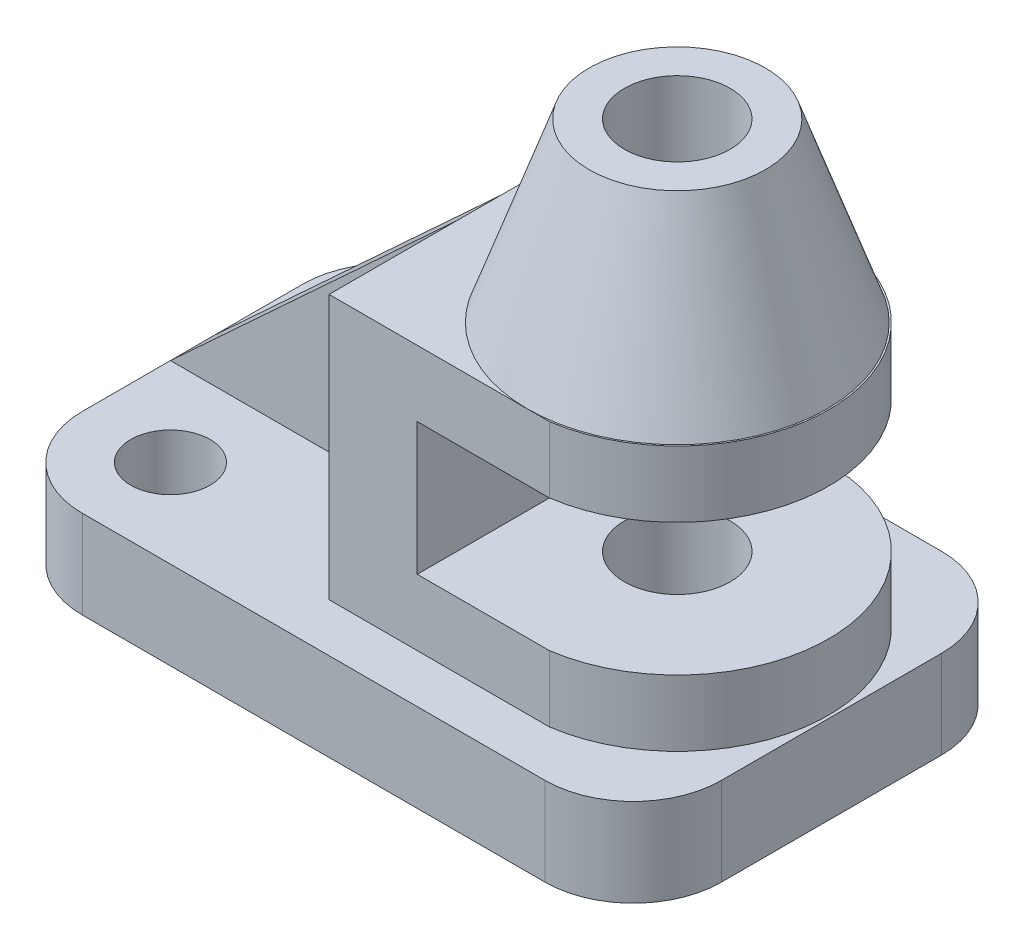
ISO-10303-21;
HEADER;
FILE_DESCRIPTION(('STEP AP214'),'2;1');
FILE_NAME('part.step','',(''),(''),'','','');
FILE_SCHEMA(('AUTOMOTIVE_DESIGN { 1 0 10303 214 1 1 1 1 }'));
ENDSEC;
DATA;
#1=APPLICATION_CONTEXT('core data for automotive mechanical design processes');
#2=APPLICATION_PROTOCOL_DEFINITION('international standard','automotive_design',2000,#1);
#3=PRODUCT_CONTEXT('',#1,'mechanical');
#4=PRODUCT('Part','Part','',(#3));
#5=PRODUCT_RELATED_PRODUCT_CATEGORY('part','',(#4));
#6=PRODUCT_DEFINITION_FORMATION('','',#4);
#7=PRODUCT_DEFINITION_CONTEXT('part definition',#1,'design');
#8=PRODUCT_DEFINITION('design','',#6,#7);
#9=PRODUCT_DEFINITION_SHAPE('','',#8);
#10=(LENGTH_UNIT() NAMED_UNIT(*) SI_UNIT(.MILLI.,.METRE.));
#11=(NAMED_UNIT(*) PLANE_ANGLE_UNIT() SI_UNIT($,.RADIAN.));
#12=(NAMED_UNIT(*) SI_UNIT($,.STERADIAN.) SOLID_ANGLE_UNIT());
#13=UNCERTAINTY_MEASURE_WITH_UNIT(LENGTH_MEASURE(1.E-05),#10,'distance_accuracy_value','');
#14=(GEOMETRIC_REPRESENTATION_CONTEXT(3) GLOBAL_UNCERTAINTY_ASSIGNED_CONTEXT((#13)) GLOBAL_UNIT_ASSIGNED_CONTEXT((#10,
#11,#12)) REPRESENTATION_CONTEXT('',''));
#15=CARTESIAN_POINT('',(0.,0.,0.));
#16=DIRECTION('',(0.,0.,1.));
#17=DIRECTION('',(1.,0.,0.));
#18=AXIS2_PLACEMENT_3D('',#15,#16,#17);
#19=CARTESIAN_POINT('',(52.5,20.,25.));
#20=DIRECTION('',(0.,-1.,0.));
#21=DIRECTION('',(0.,0.,-1.));
#22=AXIS2_PLACEMENT_3D('',#19,#20,#21);
#23=PLANE('',#22);
#24=CARTESIAN_POINT('',(-52.5,20.,-25.));
#25=DIRECTION('',(0.,1.,0.));
#26=DIRECTION('',(0.,0.,1.));
#27=AXIS2_PLACEMENT_3D('',#24,#25,#26);
#28=CIRCLE('',#27,9.);
#29=CARTESIAN_POINT('',(-52.5,20.,-16.));
#30=VERTEX_POINT('',#29);
#31=EDGE_CURVE('E224',#30,#30,#28,.T.);
#32=ORIENTED_EDGE('',*,*,#31,.F.);
#33=EDGE_LOOP('',(#32));
#34=FACE_BOUND('',#33,.T.);
#35=CARTESIAN_POINT('',(-52.5,20.,25.));
#36=DIRECTION('',(0.,1.,0.));
#37=DIRECTION('',(0.,0.,1.));
#38=AXIS2_PLACEMENT_3D('',#35,#36,#37);
#39=CIRCLE('',#38,9.);
#40=CARTESIAN_POINT('',(-52.5,20.,34.));
#41=VERTEX_POINT('',#40);
#42=EDGE_CURVE('E363',#41,#41,#39,.T.);
#43=ORIENTED_EDGE('',*,*,#42,.F.);
#44=EDGE_LOOP('',(#43));
#45=FACE_BOUND('',#44,.T.);
#46=DIRECTION('',(1.,0.,0.));
#47=VECTOR('',#46,1.);
#48=CARTESIAN_POINT('',(-7.49999999999998,20.,5.));
#49=LINE('',#48,#47);
#50=CARTESIAN_POINT('',(-72.5,20.,5.));
#51=VERTEX_POINT('',#50);
#52=CARTESIAN_POINT('',(-7.49999999999998,20.,5.));
#53=VERTEX_POINT('',#52);
#54=EDGE_CURVE('E180',#51,#53,#49,.T.);
#55=ORIENTED_EDGE('',*,*,#54,.F.);
#56=DIRECTION('',(0.,0.,1.));
#57=VECTOR('',#56,1.);
#58=CARTESIAN_POINT('',(-72.5,20.,-24.9999999999999));
#59=LINE('',#58,#57);
#60=CARTESIAN_POINT('',(-72.5,20.,24.9999999999999));
#61=VERTEX_POINT('',#60);
#62=EDGE_CURVE('E199',#51,#61,#59,.T.);
#63=ORIENTED_EDGE('',*,*,#62,.T.);
#64=CARTESIAN_POINT('',(-52.5,20.,25.));
#65=DIRECTION('',(0.,1.,0.));
#66=DIRECTION('',(0.,0.,-1.));
#67=AXIS2_PLACEMENT_3D('',#64,#65,#66);
#68=CIRCLE('',#67,20.);
#69=CARTESIAN_POINT('',(-52.4999999999999,20.,45.));
#70=VERTEX_POINT('',#69);
#71=EDGE_CURVE('E211',#61,#70,#68,.T.);
#72=ORIENTED_EDGE('',*,*,#71,.T.);
#73=DIRECTION('',(1.,0.,0.));
#74=VECTOR('',#73,1.);
#75=CARTESIAN_POINT('',(52.4999999999999,20.,45.));
#76=LINE('',#75,#74);
#77=CARTESIAN_POINT('',(52.4999999999999,20.,45.));
#78=VERTEX_POINT('',#77);
#79=EDGE_CURVE('E217',#70,#78,#76,.T.);
#80=ORIENTED_EDGE('',*,*,#79,.T.);
#81=CARTESIAN_POINT('',(52.5,20.,25.));
#82=DIRECTION('',(0.,1.,0.));
#83=DIRECTION('',(0.,0.,-1.));
#84=AXIS2_PLACEMENT_3D('',#81,#82,#83);
#85=CIRCLE('',#84,20.);
#86=CARTESIAN_POINT('',(72.5,20.,24.9999999999998));
#87=VERTEX_POINT('',#86);
#88=EDGE_CURVE('E238',#78,#87,#85,.T.);
#89=ORIENTED_EDGE('',*,*,#88,.T.);
#90=DIRECTION('',(0.,0.,-1.));
#91=VECTOR('',#90,1.);
#92=CARTESIAN_POINT('',(72.5,20.,-24.9999999999999));
#93=LINE('',#92,#91);
#94=CARTESIAN_POINT('',(72.5,20.,-24.9999999999999));
#95=VERTEX_POINT('',#94);
#96=EDGE_CURVE('E375',#87,#95,#93,.T.);
#97=ORIENTED_EDGE('',*,*,#96,.T.);
#98=CARTESIAN_POINT('',(52.5,20.,-25.));
#99=DIRECTION('',(0.,1.,0.));
#100=DIRECTION('',(0.,0.,1.));
#101=AXIS2_PLACEMENT_3D('',#98,#99,#100);
#102=CIRCLE('',#101,20.);
#103=CARTESIAN_POINT('',(52.4999999999999,20.,-45.));
#104=VERTEX_POINT('',#103);
#105=EDGE_CURVE('E377',#95,#104,#102,.T.);
#106=ORIENTED_EDGE('',*,*,#105,.T.);
#107=DIRECTION('',(-1.,0.,0.));
#108=VECTOR('',#107,1.);
#109=CARTESIAN_POINT('',(52.4999999999999,20.,-45.));
#110=LINE('',#109,#108);
#111=CARTESIAN_POINT('',(-52.4999999999999,20.,-45.));
#112=VERTEX_POINT('',#111);
#113=EDGE_CURVE('E212',#104,#112,#110,.T.);
#114=ORIENTED_EDGE('',*,*,#113,.T.);
#115=CARTESIAN_POINT('',(-52.5,20.,-25.));
#116=DIRECTION('',(0.,1.,0.));
#117=DIRECTION('',(0.,0.,1.));
#118=AXIS2_PLACEMENT_3D('',#115,#116,#117);
#119=CIRCLE('',#118,20.);
#120=CARTESIAN_POINT('',(-72.5,20.,-24.9999999999999));
#121=VERTEX_POINT('',#120);
#122=EDGE_CURVE('E209',#112,#121,#119,.T.);
#123=ORIENTED_EDGE('',*,*,#122,.T.);
#124=CARTESIAN_POINT('',(-72.5,20.,-5.));
#125=VERTEX_POINT('',#124);
#126=EDGE_CURVE('E208',#121,#125,#59,.T.);
#127=ORIENTED_EDGE('',*,*,#126,.T.);
#128=DIRECTION('',(1.,0.,0.));
#129=VECTOR('',#128,1.);
#130=CARTESIAN_POINT('',(-7.49999999999998,20.,-5.));
#131=LINE('',#130,#129);
#132=CARTESIAN_POINT('',(-7.49999999999998,20.,-5.));
#133=VERTEX_POINT('',#132);
#134=EDGE_CURVE('E393',#125,#133,#131,.T.);
#135=ORIENTED_EDGE('',*,*,#134,.T.);
#136=DIRECTION('',(0.,0.,1.));
#137=VECTOR('',#136,1.);
#138=CARTESIAN_POINT('',(-7.49999999999999,20.,0.));
#139=LINE('',#138,#137);
#140=CARTESIAN_POINT('',(-7.49999999999999,20.,-34.));
#141=VERTEX_POINT('',#140);
#142=EDGE_CURVE('E352',#141,#133,#139,.T.);
#143=ORIENTED_EDGE('',*,*,#142,.F.);
#144=DIRECTION('',(1.,0.,0.));
#145=VECTOR('',#144,1.);
#146=CARTESIAN_POINT('',(0.,20.,-34.));
#147=LINE('',#146,#145);
#148=CARTESIAN_POINT('',(42.5,20.,-34.));
#149=VERTEX_POINT('',#148);
#150=EDGE_CURVE('E338',#141,#149,#147,.T.);
#151=ORIENTED_EDGE('',*,*,#150,.T.);
#152=CARTESIAN_POINT('',(37.5000000000001,20.,0.));
#153=DIRECTION('',(0.,1.,0.));
#154=DIRECTION('',(0.,0.,-1.));
#155=AXIS2_PLACEMENT_3D('',#152,#153,#154);
#156=CIRCLE('',#155,34.3656805548792);
#157=CARTESIAN_POINT('',(42.5,20.,34.));
#158=VERTEX_POINT('',#157);
#159=EDGE_CURVE('E322',#158,#149,#156,.T.);
#160=ORIENTED_EDGE('',*,*,#159,.F.);
#161=DIRECTION('',(1.,0.,0.));
#162=VECTOR('',#161,1.);
#163=CARTESIAN_POINT('',(0.,20.,34.));
#164=LINE('',#163,#162);
#165=CARTESIAN_POINT('',(-7.49999999999998,20.,34.));
#166=VERTEX_POINT('',#165);
#167=EDGE_CURVE('E342',#166,#158,#164,.T.);
#168=ORIENTED_EDGE('',*,*,#167,.F.);
#169=EDGE_CURVE('E202',#53,#166,#139,.T.);
#170=ORIENTED_EDGE('',*,*,#169,.F.);
#171=EDGE_LOOP('',(#55,#63,#72,#80,#89,#97,#106,#114,#123,#127,#135,#143,#151,#160,#168,#170));
#172=FACE_BOUND('',#171,.T.);
#173=ADVANCED_FACE('F37',(#34,#45,#172),#23,.F.);
#174=CARTESIAN_POINT('',(-7.49999999999999,80.,0.));
#175=DIRECTION('',(1.,0.,0.));
#176=DIRECTION('',(0.,0.,-1.));
#177=AXIS2_PLACEMENT_3D('',#174,#175,#176);
#178=PLANE('',#177);
#179=DIRECTION('',(0.,1.,0.));
#180=VECTOR('',#179,1.);
#181=CARTESIAN_POINT('',(-7.49999999999998,80.,5.));
#182=LINE('',#181,#180);
#183=CARTESIAN_POINT('',(-7.49999999999998,80.,5.));
#184=VERTEX_POINT('',#183);
#185=EDGE_CURVE('E182',#53,#184,#182,.T.);
#186=ORIENTED_EDGE('',*,*,#185,.F.);
#187=ORIENTED_EDGE('',*,*,#169,.T.);
#188=DIRECTION('',(0.,-1.,0.));
#189=VECTOR('',#188,1.);
#190=CARTESIAN_POINT('',(-7.49999999999998,80.,34.));
#191=LINE('',#190,#189);
#192=CARTESIAN_POINT('',(-7.49999999999998,80.,34.));
#193=VERTEX_POINT('',#192);
#194=EDGE_CURVE('E357',#193,#166,#191,.T.);
#195=ORIENTED_EDGE('',*,*,#194,.F.);
#196=DIRECTION('',(0.,0.,1.));
#197=VECTOR('',#196,1.);
#198=CARTESIAN_POINT('',(-7.49999999999999,80.,0.));
#199=LINE('',#198,#197);
#200=EDGE_CURVE('E347',#184,#193,#199,.T.);
#201=ORIENTED_EDGE('',*,*,#200,.F.);
#202=EDGE_LOOP('',(#186,#187,#195,#201));
#203=FACE_BOUND('',#202,.T.);
#204=ADVANCED_FACE('F418',(#203),#178,.F.);
#205=CARTESIAN_POINT('',(0.,80.,-34.));
#206=DIRECTION('',(0.,0.,-1.));
#207=DIRECTION('',(-1.,0.,0.));
#208=AXIS2_PLACEMENT_3D('',#205,#206,#207);
#209=PLANE('',#208);
#210=DIRECTION('',(0.,-1.,0.));
#211=VECTOR('',#210,1.);
#212=CARTESIAN_POINT('',(42.5,80.,-34.));
#213=LINE('',#212,#211);
#214=CARTESIAN_POINT('',(42.5,80.,-34.));
#215=VERTEX_POINT('',#214);
#216=CARTESIAN_POINT('',(42.5,65.,-34.));
#217=VERTEX_POINT('',#216);
#218=EDGE_CURVE('E331',#215,#217,#213,.T.);
#219=ORIENTED_EDGE('',*,*,#218,.T.);
#220=DIRECTION('',(-1.,0.,0.));
#221=VECTOR('',#220,1.);
#222=CARTESIAN_POINT('',(12.5,65.,-34.));
#223=LINE('',#222,#221);
#224=CARTESIAN_POINT('',(12.5,65.,-34.));
#225=VERTEX_POINT('',#224);
#226=EDGE_CURVE('E276',#217,#225,#223,.T.);
#227=ORIENTED_EDGE('',*,*,#226,.T.);
#228=DIRECTION('',(0.,-1.,0.));
#229=VECTOR('',#228,1.);
#230=CARTESIAN_POINT('',(12.5,65.,-34.));
#231=LINE('',#230,#229);
#232=CARTESIAN_POINT('',(12.5,35.,-34.));
#233=VERTEX_POINT('',#232);
#234=EDGE_CURVE('E269',#225,#233,#231,.T.);
#235=ORIENTED_EDGE('',*,*,#234,.T.);
#236=DIRECTION('',(-1.,0.,0.));
#237=VECTOR('',#236,1.);
#238=CARTESIAN_POINT('',(12.5,35.,-34.));
#239=LINE('',#238,#237);
#240=CARTESIAN_POINT('',(42.5,35.,-34.));
#241=VERTEX_POINT('',#240);
#242=EDGE_CURVE('E428',#241,#233,#239,.T.);
#243=ORIENTED_EDGE('',*,*,#242,.F.);
#244=EDGE_CURVE('E328',#241,#149,#213,.T.);
#245=ORIENTED_EDGE('',*,*,#244,.T.);
#246=ORIENTED_EDGE('',*,*,#150,.F.);
#247=DIRECTION('',(0.,-1.,0.));
#248=VECTOR('',#247,1.);
#249=CARTESIAN_POINT('',(-7.49999999999999,80.,-34.));
#250=LINE('',#249,#248);
#251=CARTESIAN_POINT('',(-7.49999999999999,80.,-34.));
#252=VERTEX_POINT('',#251);
#253=EDGE_CURVE('E360',#252,#141,#250,.T.);
#254=ORIENTED_EDGE('',*,*,#253,.F.);
#255=DIRECTION('',(1.,0.,0.));
#256=VECTOR('',#255,1.);
#257=CARTESIAN_POINT('',(0.,80.,-34.));
#258=LINE('',#257,#256);
#259=CARTESIAN_POINT('',(37.5002746221857,80.,-34.));
#260=VERTEX_POINT('',#259);
#261=EDGE_CURVE('E341',#252,#260,#258,.T.);
#262=ORIENTED_EDGE('',*,*,#261,.T.);
#263=EDGE_CURVE('E339',#260,#215,#258,.T.);
#264=ORIENTED_EDGE('',*,*,#263,.T.);
#265=EDGE_LOOP('',(#219,#227,#235,#243,#245,#246,#254,#262,#264));
#266=FACE_BOUND('',#265,.T.);
#267=ADVANCED_FACE('F403',(#266),#209,.T.);
#268=CARTESIAN_POINT('',(0.,80.,34.));
#269=DIRECTION('',(0.,0.,-1.));
#270=DIRECTION('',(-1.,0.,0.));
#271=AXIS2_PLACEMENT_3D('',#268,#269,#270);
#272=PLANE('',#271);
#273=DIRECTION('',(1.,0.,0.));
#274=VECTOR('',#273,1.);
#275=CARTESIAN_POINT('',(12.5,65.,34.));
#276=LINE('',#275,#274);
#277=CARTESIAN_POINT('',(12.5,65.,34.));
#278=VERTEX_POINT('',#277);
#279=CARTESIAN_POINT('',(42.5,65.,34.));
#280=VERTEX_POINT('',#279);
#281=EDGE_CURVE('E427',#278,#280,#276,.T.);
#282=ORIENTED_EDGE('',*,*,#281,.T.);
#283=DIRECTION('',(0.,-1.,0.));
#284=VECTOR('',#283,1.);
#285=CARTESIAN_POINT('',(42.5,80.,34.));
#286=LINE('',#285,#284);
#287=CARTESIAN_POINT('',(42.5,80.,34.));
#288=VERTEX_POINT('',#287);
#289=EDGE_CURVE('E335',#288,#280,#286,.T.);
#290=ORIENTED_EDGE('',*,*,#289,.F.);
#291=DIRECTION('',(1.,0.,0.));
#292=VECTOR('',#291,1.);
#293=CARTESIAN_POINT('',(0.,80.,34.));
#294=LINE('',#293,#292);
#295=CARTESIAN_POINT('',(37.5000000000001,80.,34.));
#296=VERTEX_POINT('',#295);
#297=EDGE_CURVE('E346',#296,#288,#294,.T.);
#298=ORIENTED_EDGE('',*,*,#297,.F.);
#299=EDGE_CURVE('E349',#193,#296,#294,.T.);
#300=ORIENTED_EDGE('',*,*,#299,.F.);
#301=ORIENTED_EDGE('',*,*,#194,.T.);
#302=ORIENTED_EDGE('',*,*,#167,.T.);
#303=CARTESIAN_POINT('',(42.5,35.,34.));
#304=VERTEX_POINT('',#303);
#305=EDGE_CURVE('E334',#304,#158,#286,.T.);
#306=ORIENTED_EDGE('',*,*,#305,.F.);
#307=DIRECTION('',(1.,0.,0.));
#308=VECTOR('',#307,1.);
#309=CARTESIAN_POINT('',(12.5,35.,34.));
#310=LINE('',#309,#308);
#311=CARTESIAN_POINT('',(12.5,35.,34.));
#312=VERTEX_POINT('',#311);
#313=EDGE_CURVE('E62',#312,#304,#310,.T.);
#314=ORIENTED_EDGE('',*,*,#313,.F.);
#315=DIRECTION('',(0.,-1.,0.));
#316=VECTOR('',#315,1.);
#317=CARTESIAN_POINT('',(12.5,65.,34.));
#318=LINE('',#317,#316);
#319=EDGE_CURVE('E264',#278,#312,#318,.T.);
#320=ORIENTED_EDGE('',*,*,#319,.F.);
#321=EDGE_LOOP('',(#282,#290,#298,#300,#301,#302,#306,#314,#320));
#322=FACE_BOUND('',#321,.T.);
#323=ADVANCED_FACE('F412',(#322),#272,.F.);
#324=CARTESIAN_POINT('',(37.5000000000001,80.,0.));
#325=DIRECTION('',(0.,-1.,0.));
#326=DIRECTION('',(0.,0.,-1.));
#327=AXIS2_PLACEMENT_3D('',#324,#325,#326);
#328=CYLINDRICAL_SURFACE('',#327,34.3656805548792);
#329=CARTESIAN_POINT('',(37.5000000000001,65.,0.));
#330=DIRECTION('',(0.,1.,0.));
#331=DIRECTION('',(0.,0.,-1.));
#332=AXIS2_PLACEMENT_3D('',#329,#330,#331);
#333=CIRCLE('',#332,34.3656805548792);
#334=EDGE_CURVE('E430',#280,#217,#333,.T.);
#335=ORIENTED_EDGE('',*,*,#334,.T.);
#336=ORIENTED_EDGE('',*,*,#218,.F.);
#337=CARTESIAN_POINT('',(37.5000000000001,80.,0.));
#338=DIRECTION('',(0.,1.,0.));
#339=DIRECTION('',(0.,0.,-1.));
#340=AXIS2_PLACEMENT_3D('',#337,#338,#339);
#341=CIRCLE('',#340,34.3656805548792);
#342=EDGE_CURVE('E325',#288,#215,#341,.T.);
#343=ORIENTED_EDGE('',*,*,#342,.F.);
#344=ORIENTED_EDGE('',*,*,#289,.T.);
#345=EDGE_LOOP('',(#335,#336,#343,#344));
#346=FACE_BOUND('',#345,.T.);
#347=ADVANCED_FACE('F446',(#346),#328,.T.);
#348=CARTESIAN_POINT('',(37.5000000000001,0.,0.));
#349=DIRECTION('',(0.,1.,0.));
#350=DIRECTION('',(0.,0.,1.));
#351=AXIS2_PLACEMENT_3D('',#348,#349,#350);
#352=CYLINDRICAL_SURFACE('',#351,12.);
#353=CARTESIAN_POINT('',(37.5000000000001,120.,0.));
#354=DIRECTION('',(0.,1.,0.));
#355=DIRECTION('',(0.,0.,1.));
#356=AXIS2_PLACEMENT_3D('',#353,#354,#355);
#357=CIRCLE('',#356,12.);
#358=CARTESIAN_POINT('',(37.5000000000001,120.,12.));
#359=VERTEX_POINT('',#358);
#360=EDGE_CURVE('E268',#359,#359,#357,.T.);
#361=ORIENTED_EDGE('',*,*,#360,.T.);
#362=EDGE_LOOP('',(#361));
#363=FACE_BOUND('',#362,.T.);
#364=CARTESIAN_POINT('',(37.5000000000001,65.,0.));
#365=DIRECTION('',(0.,-1.,0.));
#366=DIRECTION('',(0.,0.,-1.));
#367=AXIS2_PLACEMENT_3D('',#364,#365,#366);
#368=CIRCLE('',#367,12.);
#369=CARTESIAN_POINT('',(37.5000000000001,65.,-12.));
#370=VERTEX_POINT('',#369);
#371=EDGE_CURVE('E41',#370,#370,#368,.F.);
#372=ORIENTED_EDGE('',*,*,#371,.F.);
#373=EDGE_LOOP('',(#372));
#374=FACE_BOUND('',#373,.T.);
#375=ADVANCED_FACE('F463',(#363,#374),#352,.F.);
#376=CARTESIAN_POINT('',(0.,80.,0.));
#377=DIRECTION('',(0.,1.,0.));
#378=DIRECTION('',(0.,0.,1.));
#379=AXIS2_PLACEMENT_3D('',#376,#377,#378);
#380=PLANE('',#379);
#381=ORIENTED_EDGE('',*,*,#299,.T.);
#382=CARTESIAN_POINT('',(37.5000000000001,80.,0.));
#383=DIRECTION('',(0.,-1.,0.));
#384=DIRECTION('',(0.,0.,-1.));
#385=AXIS2_PLACEMENT_3D('',#382,#383,#384);
#386=CIRCLE('',#385,34.);
#387=EDGE_CURVE('E12',#296,#260,#386,.T.);
#388=ORIENTED_EDGE('',*,*,#387,.T.);
#389=ORIENTED_EDGE('',*,*,#261,.F.);
#390=CARTESIAN_POINT('',(-7.49999999999999,80.,-5.));
#391=VERTEX_POINT('',#390);
#392=EDGE_CURVE('E343',#252,#391,#199,.T.);
#393=ORIENTED_EDGE('',*,*,#392,.T.);
#394=DIRECTION('',(0.,0.,-1.));
#395=VECTOR('',#394,1.);
#396=CARTESIAN_POINT('',(-7.49999999999998,80.,5.));
#397=LINE('',#396,#395);
#398=EDGE_CURVE('E195',#184,#391,#397,.T.);
#399=ORIENTED_EDGE('',*,*,#398,.F.);
#400=ORIENTED_EDGE('',*,*,#200,.T.);
#401=EDGE_LOOP('',(#381,#388,#389,#393,#399,#400));
#402=FACE_BOUND('',#401,.T.);
#403=ADVANCED_FACE('F452',(#402),#380,.T.);
#404=ORIENTED_EDGE('',*,*,#263,.F.);
#405=CARTESIAN_POINT('',(37.5000000000001,80.,0.));
#406=DIRECTION('',(0.,1.,0.));
#407=DIRECTION('',(0.,0.,1.));
#408=AXIS2_PLACEMENT_3D('',#405,#406,#407);
#409=CIRCLE('',#408,34.);
#410=EDGE_CURVE('E259',#296,#260,#409,.T.);
#411=ORIENTED_EDGE('',*,*,#410,.F.);
#412=ORIENTED_EDGE('',*,*,#297,.T.);
#413=ORIENTED_EDGE('',*,*,#342,.T.);
#414=EDGE_LOOP('',(#404,#411,#412,#413));
#415=FACE_BOUND('',#414,.T.);
#416=ADVANCED_FACE('F454',(#415),#380,.T.);
#417=CARTESIAN_POINT('',(52.5,0.,25.));
#418=DIRECTION('',(0.,-1.,0.));
#419=DIRECTION('',(0.,0.,-1.));
#420=AXIS2_PLACEMENT_3D('',#417,#418,#419);
#421=PLANE('',#420);
#422=CARTESIAN_POINT('',(37.5000000000001,0.,0.));
#423=DIRECTION('',(0.,1.,0.));
#424=DIRECTION('',(0.,0.,1.));
#425=AXIS2_PLACEMENT_3D('',#422,#423,#424);
#426=CIRCLE('',#425,12.);
#427=CARTESIAN_POINT('',(37.5000000000001,0.,12.));
#428=VERTEX_POINT('',#427);
#429=EDGE_CURVE('E261',#428,#428,#426,.T.);
#430=ORIENTED_EDGE('',*,*,#429,.T.);
#431=EDGE_LOOP('',(#430));
#432=FACE_BOUND('',#431,.T.);
#433=CARTESIAN_POINT('',(-52.5,0.,-25.));
#434=DIRECTION('',(0.,1.,0.));
#435=DIRECTION('',(0.,0.,1.));
#436=AXIS2_PLACEMENT_3D('',#433,#434,#435);
#437=CIRCLE('',#436,9.);
#438=CARTESIAN_POINT('',(-52.5,0.,-16.));
#439=VERTEX_POINT('',#438);
#440=EDGE_CURVE('E366',#439,#439,#437,.T.);
#441=ORIENTED_EDGE('',*,*,#440,.T.);
#442=EDGE_LOOP('',(#441));
#443=FACE_BOUND('',#442,.T.);
#444=CARTESIAN_POINT('',(52.5,0.,25.));
#445=DIRECTION('',(0.,1.,0.));
#446=DIRECTION('',(0.,0.,-1.));
#447=AXIS2_PLACEMENT_3D('',#444,#445,#446);
#448=CIRCLE('',#447,20.);
#449=CARTESIAN_POINT('',(52.4999999999999,0.,45.));
#450=VERTEX_POINT('',#449);
#451=CARTESIAN_POINT('',(72.5,0.,24.9999999999998));
#452=VERTEX_POINT('',#451);
#453=EDGE_CURVE('E220',#450,#452,#448,.T.);
#454=ORIENTED_EDGE('',*,*,#453,.F.);
#455=DIRECTION('',(1.,0.,0.));
#456=VECTOR('',#455,1.);
#457=CARTESIAN_POINT('',(52.4999999999999,0.,45.));
#458=LINE('',#457,#456);
#459=CARTESIAN_POINT('',(-52.4999999999999,0.,45.));
#460=VERTEX_POINT('',#459);
#461=EDGE_CURVE('E236',#460,#450,#458,.T.);
#462=ORIENTED_EDGE('',*,*,#461,.F.);
#463=CARTESIAN_POINT('',(-52.5,0.,25.));
#464=DIRECTION('',(0.,1.,0.));
#465=DIRECTION('',(0.,0.,-1.));
#466=AXIS2_PLACEMENT_3D('',#463,#464,#465);
#467=CIRCLE('',#466,20.);
#468=CARTESIAN_POINT('',(-72.5,0.,24.9999999999999));
#469=VERTEX_POINT('',#468);
#470=EDGE_CURVE('E234',#469,#460,#467,.T.);
#471=ORIENTED_EDGE('',*,*,#470,.F.);
#472=DIRECTION('',(0.,0.,1.));
#473=VECTOR('',#472,1.);
#474=CARTESIAN_POINT('',(-72.5,0.,-24.9999999999999));
#475=LINE('',#474,#473);
#476=CARTESIAN_POINT('',(-72.5,0.,-24.9999999999999));
#477=VERTEX_POINT('',#476);
#478=EDGE_CURVE('E232',#477,#469,#475,.T.);
#479=ORIENTED_EDGE('',*,*,#478,.F.);
#480=CARTESIAN_POINT('',(-52.5,0.,-25.));
#481=DIRECTION('',(0.,1.,0.));
#482=DIRECTION('',(0.,0.,1.));
#483=AXIS2_PLACEMENT_3D('',#480,#481,#482);
#484=CIRCLE('',#483,20.);
#485=CARTESIAN_POINT('',(-52.4999999999999,0.,-45.));
#486=VERTEX_POINT('',#485);
#487=EDGE_CURVE('E230',#486,#477,#484,.T.);
#488=ORIENTED_EDGE('',*,*,#487,.F.);
#489=DIRECTION('',(-1.,0.,0.));
#490=VECTOR('',#489,1.);
#491=CARTESIAN_POINT('',(52.4999999999999,0.,-45.));
#492=LINE('',#491,#490);
#493=CARTESIAN_POINT('',(52.4999999999999,0.,-45.));
#494=VERTEX_POINT('',#493);
#495=EDGE_CURVE('E228',#494,#486,#492,.T.);
#496=ORIENTED_EDGE('',*,*,#495,.F.);
#497=CARTESIAN_POINT('',(52.5,0.,-25.));
#498=DIRECTION('',(0.,1.,0.));
#499=DIRECTION('',(0.,0.,1.));
#500=AXIS2_PLACEMENT_3D('',#497,#498,#499);
#501=CIRCLE('',#500,20.);
#502=CARTESIAN_POINT('',(72.5,0.,-24.9999999999999));
#503=VERTEX_POINT('',#502);
#504=EDGE_CURVE('E226',#503,#494,#501,.T.);
#505=ORIENTED_EDGE('',*,*,#504,.F.);
#506=DIRECTION('',(0.,0.,-1.));
#507=VECTOR('',#506,1.);
#508=CARTESIAN_POINT('',(72.5,0.,-24.9999999999999));
#509=LINE('',#508,#507);
#510=EDGE_CURVE('E223',#452,#503,#509,.T.);
#511=ORIENTED_EDGE('',*,*,#510,.F.);
#512=EDGE_LOOP('',(#454,#462,#471,#479,#488,#496,#505,#511));
#513=FACE_BOUND('',#512,.T.);
#514=CARTESIAN_POINT('',(-52.5,0.,25.));
#515=DIRECTION('',(0.,1.,0.));
#516=DIRECTION('',(0.,0.,1.));
#517=AXIS2_PLACEMENT_3D('',#514,#515,#516);
#518=CIRCLE('',#517,9.);
#519=CARTESIAN_POINT('',(-52.5,0.,34.));
#520=VERTEX_POINT('',#519);
#521=EDGE_CURVE('E362',#520,#520,#518,.T.);
#522=ORIENTED_EDGE('',*,*,#521,.T.);
#523=EDGE_LOOP('',(#522));
#524=FACE_BOUND('',#523,.T.);
#525=ADVANCED_FACE('F456',(#432,#443,#513,#524),#421,.T.);
#526=CARTESIAN_POINT('',(52.5,20.,25.));
#527=DIRECTION('',(0.,-1.,0.));
#528=DIRECTION('',(0.,0.,-1.));
#529=AXIS2_PLACEMENT_3D('',#526,#527,#528);
#530=CYLINDRICAL_SURFACE('',#529,20.);
#531=ORIENTED_EDGE('',*,*,#453,.T.);
#532=DIRECTION('',(0.,-1.,0.));
#533=VECTOR('',#532,1.);
#534=CARTESIAN_POINT('',(72.5,20.,24.9999999999998));
#535=LINE('',#534,#533);
#536=EDGE_CURVE('E46',#87,#452,#535,.T.);
#537=ORIENTED_EDGE('',*,*,#536,.F.);
#538=ORIENTED_EDGE('',*,*,#88,.F.);
#539=DIRECTION('',(0.,-1.,0.));
#540=VECTOR('',#539,1.);
#541=CARTESIAN_POINT('',(52.4999999999999,20.,45.));
#542=LINE('',#541,#540);
#543=EDGE_CURVE('E219',#78,#450,#542,.T.);
#544=ORIENTED_EDGE('',*,*,#543,.T.);
#545=EDGE_LOOP('',(#531,#537,#538,#544));
#546=FACE_BOUND('',#545,.T.);
#547=ADVANCED_FACE('F39',(#546),#530,.T.);
#548=CARTESIAN_POINT('',(72.5,20.,-24.9999999999999));
#549=DIRECTION('',(-1.,0.,0.));
#550=DIRECTION('',(0.,0.,1.));
#551=AXIS2_PLACEMENT_3D('',#548,#549,#550);
#552=PLANE('',#551);
#553=ORIENTED_EDGE('',*,*,#510,.T.);
#554=DIRECTION('',(0.,-1.,0.));
#555=VECTOR('',#554,1.);
#556=CARTESIAN_POINT('',(72.5,20.,-24.9999999999999));
#557=LINE('',#556,#555);
#558=EDGE_CURVE('E254',#95,#503,#557,.T.);
#559=ORIENTED_EDGE('',*,*,#558,.F.);
#560=ORIENTED_EDGE('',*,*,#96,.F.);
#561=ORIENTED_EDGE('',*,*,#536,.T.);
#562=EDGE_LOOP('',(#553,#559,#560,#561));
#563=FACE_BOUND('',#562,.T.);
#564=ADVANCED_FACE('F494',(#563),#552,.F.);
#565=CARTESIAN_POINT('',(52.5,20.,-25.));
#566=DIRECTION('',(0.,-1.,0.));
#567=DIRECTION('',(0.,0.,-1.));
#568=AXIS2_PLACEMENT_3D('',#565,#566,#567);
#569=CYLINDRICAL_SURFACE('',#568,20.);
#570=ORIENTED_EDGE('',*,*,#504,.T.);
#571=DIRECTION('',(0.,-1.,0.));
#572=VECTOR('',#571,1.);
#573=CARTESIAN_POINT('',(52.4999999999999,20.,-45.));
#574=LINE('',#573,#572);
#575=EDGE_CURVE('E251',#104,#494,#574,.T.);
#576=ORIENTED_EDGE('',*,*,#575,.F.);
#577=ORIENTED_EDGE('',*,*,#105,.F.);
#578=ORIENTED_EDGE('',*,*,#558,.T.);
#579=EDGE_LOOP('',(#570,#576,#577,#578));
#580=FACE_BOUND('',#579,.T.);
#581=ADVANCED_FACE('F492',(#580),#569,.T.);
#582=CARTESIAN_POINT('',(52.4999999999999,20.,-45.));
#583=DIRECTION('',(0.,0.,1.));
#584=DIRECTION('',(1.,0.,0.));
#585=AXIS2_PLACEMENT_3D('',#582,#583,#584);
#586=PLANE('',#585);
#587=ORIENTED_EDGE('',*,*,#495,.T.);
#588=DIRECTION('',(0.,-1.,0.));
#589=VECTOR('',#588,1.);
#590=CARTESIAN_POINT('',(-52.4999999999999,20.,-45.));
#591=LINE('',#590,#589);
#592=EDGE_CURVE('E248',#112,#486,#591,.T.);
#593=ORIENTED_EDGE('',*,*,#592,.F.);
#594=ORIENTED_EDGE('',*,*,#113,.F.);
#595=ORIENTED_EDGE('',*,*,#575,.T.);
#596=EDGE_LOOP('',(#587,#593,#594,#595));
#597=FACE_BOUND('',#596,.T.);
#598=ADVANCED_FACE('F385',(#597),#586,.F.);
#599=CARTESIAN_POINT('',(-52.5,20.,-25.));
#600=DIRECTION('',(0.,-1.,0.));
#601=DIRECTION('',(0.,0.,-1.));
#602=AXIS2_PLACEMENT_3D('',#599,#600,#601);
#603=CYLINDRICAL_SURFACE('',#602,20.);
#604=ORIENTED_EDGE('',*,*,#487,.T.);
#605=DIRECTION('',(0.,-1.,0.));
#606=VECTOR('',#605,1.);
#607=CARTESIAN_POINT('',(-72.5,20.,-24.9999999999999));
#608=LINE('',#607,#606);
#609=EDGE_CURVE('E245',#121,#477,#608,.T.);
#610=ORIENTED_EDGE('',*,*,#609,.F.);
#611=ORIENTED_EDGE('',*,*,#122,.F.);
#612=ORIENTED_EDGE('',*,*,#592,.T.);
#613=EDGE_LOOP('',(#604,#610,#611,#612));
#614=FACE_BOUND('',#613,.T.);
#615=ADVANCED_FACE('F389',(#614),#603,.T.);
#616=CARTESIAN_POINT('',(-72.5,20.,-24.9999999999999));
#617=DIRECTION('',(1.,0.,0.));
#618=DIRECTION('',(0.,0.,-1.));
#619=AXIS2_PLACEMENT_3D('',#616,#617,#618);
#620=PLANE('',#619);
#621=ORIENTED_EDGE('',*,*,#478,.T.);
#622=DIRECTION('',(0.,-1.,0.));
#623=VECTOR('',#622,1.);
#624=CARTESIAN_POINT('',(-72.5,20.,24.9999999999999));
#625=LINE('',#624,#623);
#626=EDGE_CURVE('E206',#61,#469,#625,.T.);
#627=ORIENTED_EDGE('',*,*,#626,.F.);
#628=ORIENTED_EDGE('',*,*,#62,.F.);
#629=DIRECTION('',(0.,0.,-1.));
#630=VECTOR('',#629,1.);
#631=CARTESIAN_POINT('',(-72.5,20.,5.));
#632=LINE('',#631,#630);
#633=EDGE_CURVE('E188',#51,#125,#632,.T.);
#634=ORIENTED_EDGE('',*,*,#633,.T.);
#635=ORIENTED_EDGE('',*,*,#126,.F.);
#636=ORIENTED_EDGE('',*,*,#609,.T.);
#637=EDGE_LOOP('',(#621,#627,#628,#634,#635,#636));
#638=FACE_BOUND('',#637,.T.);
#639=ADVANCED_FACE('F204',(#638),#620,.F.);
#640=CARTESIAN_POINT('',(-52.5,20.,25.));
#641=DIRECTION('',(0.,-1.,0.));
#642=DIRECTION('',(0.,0.,-1.));
#643=AXIS2_PLACEMENT_3D('',#640,#641,#642);
#644=CYLINDRICAL_SURFACE('',#643,20.);
#645=ORIENTED_EDGE('',*,*,#470,.T.);
#646=DIRECTION('',(0.,-1.,0.));
#647=VECTOR('',#646,1.);
#648=CARTESIAN_POINT('',(-52.4999999999999,20.,45.));
#649=LINE('',#648,#647);
#650=EDGE_CURVE('E241',#70,#460,#649,.T.);
#651=ORIENTED_EDGE('',*,*,#650,.F.);
#652=ORIENTED_EDGE('',*,*,#71,.F.);
#653=ORIENTED_EDGE('',*,*,#626,.T.);
#654=EDGE_LOOP('',(#645,#651,#652,#653));
#655=FACE_BOUND('',#654,.T.);
#656=ADVANCED_FACE('F481',(#655),#644,.T.);
#657=CARTESIAN_POINT('',(52.4999999999999,20.,45.));
#658=DIRECTION('',(0.,0.,-1.));
#659=DIRECTION('',(-1.,0.,0.));
#660=AXIS2_PLACEMENT_3D('',#657,#658,#659);
#661=PLANE('',#660);
#662=ORIENTED_EDGE('',*,*,#461,.T.);
#663=ORIENTED_EDGE('',*,*,#543,.F.);
#664=ORIENTED_EDGE('',*,*,#79,.F.);
#665=ORIENTED_EDGE('',*,*,#650,.T.);
#666=EDGE_LOOP('',(#662,#663,#664,#665));
#667=FACE_BOUND('',#666,.T.);
#668=ADVANCED_FACE('F478',(#667),#661,.F.);
#669=CARTESIAN_POINT('',(-52.5,20.,-25.));
#670=DIRECTION('',(0.,-1.,0.));
#671=DIRECTION('',(0.,0.,-1.));
#672=AXIS2_PLACEMENT_3D('',#669,#670,#671);
#673=CYLINDRICAL_SURFACE('',#672,9.);
#674=ORIENTED_EDGE('',*,*,#31,.T.);
#675=EDGE_LOOP('',(#674));
#676=FACE_BOUND('',#675,.T.);
#677=ORIENTED_EDGE('',*,*,#440,.F.);
#678=EDGE_LOOP('',(#677));
#679=FACE_BOUND('',#678,.T.);
#680=ADVANCED_FACE('F475',(#676,#679),#673,.F.);
#681=CARTESIAN_POINT('',(-52.5,20.,25.));
#682=DIRECTION('',(0.,-1.,0.));
#683=DIRECTION('',(0.,0.,-1.));
#684=AXIS2_PLACEMENT_3D('',#681,#682,#683);
#685=CYLINDRICAL_SURFACE('',#684,9.);
#686=ORIENTED_EDGE('',*,*,#42,.T.);
#687=EDGE_LOOP('',(#686));
#688=FACE_BOUND('',#687,.T.);
#689=ORIENTED_EDGE('',*,*,#521,.F.);
#690=EDGE_LOOP('',(#689));
#691=FACE_BOUND('',#690,.T.);
#692=ADVANCED_FACE('F516',(#688,#691),#685,.F.);
#693=ORIENTED_EDGE('',*,*,#142,.T.);
#694=DIRECTION('',(0.,1.,0.));
#695=VECTOR('',#694,1.);
#696=CARTESIAN_POINT('',(-7.49999999999998,80.,-5.));
#697=LINE('',#696,#695);
#698=EDGE_CURVE('E185',#133,#391,#697,.T.);
#699=ORIENTED_EDGE('',*,*,#698,.T.);
#700=ORIENTED_EDGE('',*,*,#392,.F.);
#701=ORIENTED_EDGE('',*,*,#253,.T.);
#702=EDGE_LOOP('',(#693,#699,#700,#701));
#703=FACE_BOUND('',#702,.T.);
#704=ADVANCED_FACE('F397',(#703),#178,.F.);
#705=ORIENTED_EDGE('',*,*,#244,.F.);
#706=CARTESIAN_POINT('',(37.5000000000001,35.,0.));
#707=DIRECTION('',(0.,1.,0.));
#708=DIRECTION('',(0.,0.,-1.));
#709=AXIS2_PLACEMENT_3D('',#706,#707,#708);
#710=CIRCLE('',#709,34.3656805548792);
#711=EDGE_CURVE('E409',#304,#241,#710,.T.);
#712=ORIENTED_EDGE('',*,*,#711,.F.);
#713=ORIENTED_EDGE('',*,*,#305,.T.);
#714=ORIENTED_EDGE('',*,*,#159,.T.);
#715=EDGE_LOOP('',(#705,#712,#713,#714));
#716=FACE_BOUND('',#715,.T.);
#717=ADVANCED_FACE('F310',(#716),#328,.T.);
#718=CARTESIAN_POINT('',(37.5000000000001,120.,0.));
#719=DIRECTION('',(0.,1.,0.));
#720=DIRECTION('',(0.,0.,1.));
#721=AXIS2_PLACEMENT_3D('',#718,#719,#720);
#722=PLANE('',#721);
#723=ORIENTED_EDGE('',*,*,#360,.F.);
#724=EDGE_LOOP('',(#723));
#725=FACE_BOUND('',#724,.T.);
#726=CARTESIAN_POINT('',(37.5000000000001,120.,0.));
#727=DIRECTION('',(0.,1.,0.));
#728=DIRECTION('',(0.,0.,1.));
#729=AXIS2_PLACEMENT_3D('',#726,#727,#728);
#730=CIRCLE('',#729,20.);
#731=CARTESIAN_POINT('',(37.5000000000001,120.,20.));
#732=VERTEX_POINT('',#731);
#733=EDGE_CURVE('E260',#732,#732,#730,.T.);
#734=ORIENTED_EDGE('',*,*,#733,.T.);
#735=EDGE_LOOP('',(#734));
#736=FACE_BOUND('',#735,.T.);
#737=ADVANCED_FACE('F304',(#725,#736),#722,.T.);
#738=CARTESIAN_POINT('',(37.5000000000001,120.,0.));
#739=DIRECTION('',(0.,-1.,0.));
#740=DIRECTION('',(0.,0.,-1.));
#741=AXIS2_PLACEMENT_3D('',#738,#739,#740);
#742=CONICAL_SURFACE('',#741,20.,0.336674819386727);
#743=ORIENTED_EDGE('',*,*,#410,.T.);
#744=ORIENTED_EDGE('',*,*,#387,.F.);
#745=EDGE_LOOP('',(#743,#744));
#746=FACE_BOUND('',#745,.T.);
#747=ORIENTED_EDGE('',*,*,#733,.F.);
#748=EDGE_LOOP('',(#747));
#749=FACE_BOUND('',#748,.T.);
#750=ADVANCED_FACE('F293',(#746,#749),#742,.T.);
#751=CARTESIAN_POINT('',(37.5000000000001,35.,0.));
#752=DIRECTION('',(0.,-1.,0.));
#753=DIRECTION('',(0.,0.,-1.));
#754=AXIS2_PLACEMENT_3D('',#751,#752,#753);
#755=CIRCLE('',#754,12.);
#756=CARTESIAN_POINT('',(37.5000000000001,35.,-12.));
#757=VERTEX_POINT('',#756);
#758=EDGE_CURVE('E262',#757,#757,#755,.F.);
#759=ORIENTED_EDGE('',*,*,#758,.T.);
#760=EDGE_LOOP('',(#759));
#761=FACE_BOUND('',#760,.T.);
#762=ORIENTED_EDGE('',*,*,#429,.F.);
#763=EDGE_LOOP('',(#762));
#764=FACE_BOUND('',#763,.T.);
#765=ADVANCED_FACE('F303',(#761,#764),#352,.F.);
#766=CARTESIAN_POINT('',(37.5000000000001,65.,0.));
#767=DIRECTION('',(0.,-1.,0.));
#768=DIRECTION('',(0.,0.,-1.));
#769=AXIS2_PLACEMENT_3D('',#766,#767,#768);
#770=PLANE('',#769);
#771=DIRECTION('',(0.,0.,1.));
#772=VECTOR('',#771,1.);
#773=CARTESIAN_POINT('',(12.5,65.,34.));
#774=LINE('',#773,#772);
#775=EDGE_CURVE('E425',#225,#278,#774,.T.);
#776=ORIENTED_EDGE('',*,*,#775,.F.);
#777=ORIENTED_EDGE('',*,*,#226,.F.);
#778=ORIENTED_EDGE('',*,*,#334,.F.);
#779=ORIENTED_EDGE('',*,*,#281,.F.);
#780=EDGE_LOOP('',(#776,#777,#778,#779));
#781=FACE_BOUND('',#780,.T.);
#782=ORIENTED_EDGE('',*,*,#371,.T.);
#783=EDGE_LOOP('',(#782));
#784=FACE_BOUND('',#783,.T.);
#785=ADVANCED_FACE('F443',(#781,#784),#770,.T.);
#786=CARTESIAN_POINT('',(37.5000000000001,35.,0.));
#787=DIRECTION('',(0.,-1.,0.));
#788=DIRECTION('',(0.,0.,-1.));
#789=AXIS2_PLACEMENT_3D('',#786,#787,#788);
#790=PLANE('',#789);
#791=DIRECTION('',(0.,0.,1.));
#792=VECTOR('',#791,1.);
#793=CARTESIAN_POINT('',(12.5,35.,34.));
#794=LINE('',#793,#792);
#795=EDGE_CURVE('E194',#233,#312,#794,.T.);
#796=ORIENTED_EDGE('',*,*,#795,.T.);
#797=ORIENTED_EDGE('',*,*,#313,.T.);
#798=ORIENTED_EDGE('',*,*,#711,.T.);
#799=ORIENTED_EDGE('',*,*,#242,.T.);
#800=EDGE_LOOP('',(#796,#797,#798,#799));
#801=FACE_BOUND('',#800,.T.);
#802=ORIENTED_EDGE('',*,*,#758,.F.);
#803=EDGE_LOOP('',(#802));
#804=FACE_BOUND('',#803,.T.);
#805=ADVANCED_FACE('F437',(#801,#804),#790,.F.);
#806=CARTESIAN_POINT('',(12.5,65.,34.));
#807=DIRECTION('',(1.,0.,0.));
#808=DIRECTION('',(0.,0.,-1.));
#809=AXIS2_PLACEMENT_3D('',#806,#807,#808);
#810=PLANE('',#809);
#811=ORIENTED_EDGE('',*,*,#795,.F.);
#812=ORIENTED_EDGE('',*,*,#234,.F.);
#813=ORIENTED_EDGE('',*,*,#775,.T.);
#814=ORIENTED_EDGE('',*,*,#319,.T.);
#815=EDGE_LOOP('',(#811,#812,#813,#814));
#816=FACE_BOUND('',#815,.T.);
#817=ADVANCED_FACE('F439',(#816),#810,.T.);
#818=CARTESIAN_POINT('',(-72.5,20.,5.));
#819=DIRECTION('',(0.678280102733066,-0.734803444627488,0.));
#820=DIRECTION('',(0.734803444627488,0.678280102733066,0.));
#821=AXIS2_PLACEMENT_3D('',#818,#819,#820);
#822=PLANE('',#821);
#823=DIRECTION('',(-0.734803444627488,-0.678280102733066,0.));
#824=VECTOR('',#823,1.);
#825=CARTESIAN_POINT('',(-72.5,20.,-5.));
#826=LINE('',#825,#824);
#827=EDGE_CURVE('E54',#391,#125,#826,.T.);
#828=ORIENTED_EDGE('',*,*,#827,.T.);
#829=ORIENTED_EDGE('',*,*,#633,.F.);
#830=DIRECTION('',(-0.734803444627488,-0.678280102733066,0.));
#831=VECTOR('',#830,1.);
#832=CARTESIAN_POINT('',(-72.5,20.,5.));
#833=LINE('',#832,#831);
#834=EDGE_CURVE('E176',#184,#51,#833,.T.);
#835=ORIENTED_EDGE('',*,*,#834,.F.);
#836=ORIENTED_EDGE('',*,*,#398,.T.);
#837=EDGE_LOOP('',(#828,#829,#835,#836));
#838=FACE_BOUND('',#837,.T.);
#839=ADVANCED_FACE('F189',(#838),#822,.F.);
#840=CARTESIAN_POINT('',(0.,0.,5.));
#841=DIRECTION('',(0.,0.,-1.));
#842=DIRECTION('',(-1.,0.,0.));
#843=AXIS2_PLACEMENT_3D('',#840,#841,#842);
#844=PLANE('',#843);
#845=ORIENTED_EDGE('',*,*,#834,.T.);
#846=ORIENTED_EDGE('',*,*,#54,.T.);
#847=ORIENTED_EDGE('',*,*,#185,.T.);
#848=EDGE_LOOP('',(#845,#846,#847));
#849=FACE_BOUND('',#848,.T.);
#850=ADVANCED_FACE('F178',(#849),#844,.F.);
#851=CARTESIAN_POINT('',(0.,0.,-5.));
#852=DIRECTION('',(0.,0.,-1.));
#853=DIRECTION('',(-1.,0.,0.));
#854=AXIS2_PLACEMENT_3D('',#851,#852,#853);
#855=PLANE('',#854);
#856=ORIENTED_EDGE('',*,*,#827,.F.);
#857=ORIENTED_EDGE('',*,*,#698,.F.);
#858=ORIENTED_EDGE('',*,*,#134,.F.);
#859=EDGE_LOOP('',(#856,#857,#858));
#860=FACE_BOUND('',#859,.T.);
#861=ADVANCED_FACE('F584',(#860),#855,.T.);
#862=CLOSED_SHELL('',(#173,#204,#267,#323,#347,#375,#403,#416,#525,#547,#564,#581,#598,#615,
#639,#656,#668,#680,#692,#704,#717,#737,#750,#765,#785,#805,#817,#839,#850,#861));
#863=MANIFOLD_SOLID_BREP('B2',#862);
#864=ADVANCED_BREP_SHAPE_REPRESENTATION('',(#18,#863),#14);
#865=SHAPE_DEFINITION_REPRESENTATION(#9,#864);
ENDSEC;
END-ISO-10303-21;
